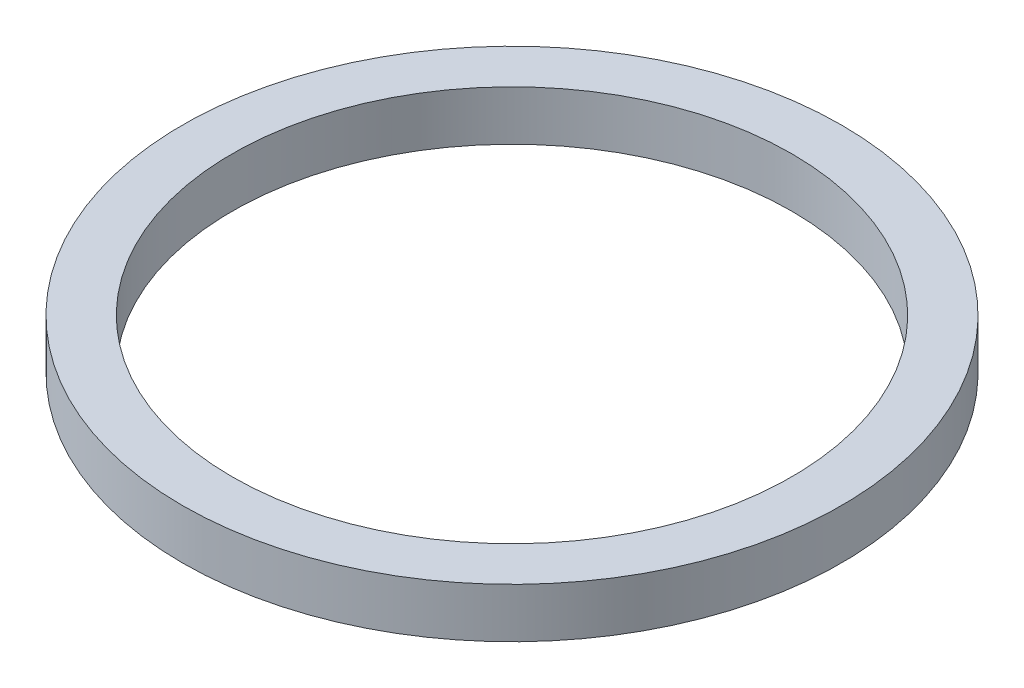
ISO-10303-21;
HEADER;
FILE_DESCRIPTION(('STEP AP214'),'2;1');
FILE_NAME('part.step','',(''),(''),'','','');
FILE_SCHEMA(('AUTOMOTIVE_DESIGN { 1 0 10303 214 1 1 1 1 }'));
ENDSEC;
DATA;
#1=APPLICATION_CONTEXT('core data for automotive mechanical design processes');
#2=APPLICATION_PROTOCOL_DEFINITION('international standard','automotive_design',2000,#1);
#3=PRODUCT_CONTEXT('',#1,'mechanical');
#4=PRODUCT('Part','Part','',(#3));
#5=PRODUCT_RELATED_PRODUCT_CATEGORY('part','',(#4));
#6=PRODUCT_DEFINITION_FORMATION('','',#4);
#7=PRODUCT_DEFINITION_CONTEXT('part definition',#1,'design');
#8=PRODUCT_DEFINITION('design','',#6,#7);
#9=PRODUCT_DEFINITION_SHAPE('','',#8);
#10=(LENGTH_UNIT() NAMED_UNIT(*) SI_UNIT(.MILLI.,.METRE.));
#11=(NAMED_UNIT(*) PLANE_ANGLE_UNIT() SI_UNIT($,.RADIAN.));
#12=(NAMED_UNIT(*) SI_UNIT($,.STERADIAN.) SOLID_ANGLE_UNIT());
#13=UNCERTAINTY_MEASURE_WITH_UNIT(LENGTH_MEASURE(1.E-05),#10,'distance_accuracy_value','');
#14=(GEOMETRIC_REPRESENTATION_CONTEXT(3) GLOBAL_UNCERTAINTY_ASSIGNED_CONTEXT((#13)) GLOBAL_UNIT_ASSIGNED_CONTEXT((#10,
#11,#12)) REPRESENTATION_CONTEXT('',''));
#15=CARTESIAN_POINT('',(0.,0.,0.));
#16=DIRECTION('',(0.,0.,1.));
#17=DIRECTION('',(1.,0.,0.));
#18=AXIS2_PLACEMENT_3D('',#15,#16,#17);
#19=CARTESIAN_POINT('',(0.,8.,0.));
#20=DIRECTION('',(0.,1.,0.));
#21=DIRECTION('',(0.,0.,1.));
#22=AXIS2_PLACEMENT_3D('',#19,#20,#21);
#23=PLANE('',#22);
#24=CARTESIAN_POINT('',(0.,8.,0.));
#25=DIRECTION('',(0.,1.,0.));
#26=DIRECTION('',(0.,0.,1.));
#27=AXIS2_PLACEMENT_3D('',#24,#25,#26);
#28=CIRCLE('',#27,53.);
#29=CARTESIAN_POINT('',(0.,8.,53.));
#30=VERTEX_POINT('',#29);
#31=EDGE_CURVE('E10',#30,#30,#28,.T.);
#32=ORIENTED_EDGE('',*,*,#31,.T.);
#33=EDGE_LOOP('',(#32));
#34=FACE_BOUND('',#33,.T.);
#35=CARTESIAN_POINT('',(0.,8.,0.));
#36=DIRECTION('',(0.,1.,0.));
#37=DIRECTION('',(0.,0.,1.));
#38=AXIS2_PLACEMENT_3D('',#35,#36,#37);
#39=CIRCLE('',#38,45.);
#40=CARTESIAN_POINT('',(0.,8.,45.));
#41=VERTEX_POINT('',#40);
#42=EDGE_CURVE('E43',#41,#41,#39,.T.);
#43=ORIENTED_EDGE('',*,*,#42,.F.);
#44=EDGE_LOOP('',(#43));
#45=FACE_BOUND('',#44,.T.);
#46=ADVANCED_FACE('F32',(#34,#45),#23,.T.);
#47=CARTESIAN_POINT('',(0.,0.,0.));
#48=DIRECTION('',(0.,1.,0.));
#49=DIRECTION('',(0.,0.,1.));
#50=AXIS2_PLACEMENT_3D('',#47,#48,#49);
#51=PLANE('',#50);
#52=CARTESIAN_POINT('',(0.,0.,0.));
#53=DIRECTION('',(0.,1.,0.));
#54=DIRECTION('',(0.,0.,1.));
#55=AXIS2_PLACEMENT_3D('',#52,#53,#54);
#56=CIRCLE('',#55,53.);
#57=CARTESIAN_POINT('',(0.,0.,53.));
#58=VERTEX_POINT('',#57);
#59=EDGE_CURVE('E36',#58,#58,#56,.T.);
#60=ORIENTED_EDGE('',*,*,#59,.F.);
#61=EDGE_LOOP('',(#60));
#62=FACE_BOUND('',#61,.T.);
#63=CARTESIAN_POINT('',(0.,0.,0.));
#64=DIRECTION('',(0.,1.,0.));
#65=DIRECTION('',(0.,0.,1.));
#66=AXIS2_PLACEMENT_3D('',#63,#64,#65);
#67=CIRCLE('',#66,45.);
#68=CARTESIAN_POINT('',(0.,0.,45.));
#69=VERTEX_POINT('',#68);
#70=EDGE_CURVE('E45',#69,#69,#67,.T.);
#71=ORIENTED_EDGE('',*,*,#70,.T.);
#72=EDGE_LOOP('',(#71));
#73=FACE_BOUND('',#72,.T.);
#74=ADVANCED_FACE('F55',(#62,#73),#51,.F.);
#75=CARTESIAN_POINT('',(0.,8.,0.));
#76=DIRECTION('',(0.,-1.,0.));
#77=DIRECTION('',(0.,0.,-1.));
#78=AXIS2_PLACEMENT_3D('',#75,#76,#77);
#79=CYLINDRICAL_SURFACE('',#78,53.);
#80=ORIENTED_EDGE('',*,*,#31,.F.);
#81=EDGE_LOOP('',(#80));
#82=FACE_BOUND('',#81,.T.);
#83=ORIENTED_EDGE('',*,*,#59,.T.);
#84=EDGE_LOOP('',(#83));
#85=FACE_BOUND('',#84,.T.);
#86=ADVANCED_FACE('F34',(#82,#85),#79,.T.);
#87=CARTESIAN_POINT('',(0.,8.,0.));
#88=DIRECTION('',(0.,-1.,0.));
#89=DIRECTION('',(0.,0.,-1.));
#90=AXIS2_PLACEMENT_3D('',#87,#88,#89);
#91=CYLINDRICAL_SURFACE('',#90,45.);
#92=ORIENTED_EDGE('',*,*,#42,.T.);
#93=EDGE_LOOP('',(#92));
#94=FACE_BOUND('',#93,.T.);
#95=ORIENTED_EDGE('',*,*,#70,.F.);
#96=EDGE_LOOP('',(#95));
#97=FACE_BOUND('',#96,.T.);
#98=ADVANCED_FACE('F51',(#94,#97),#91,.F.);
#99=CLOSED_SHELL('',(#46,#74,#86,#98));
#100=MANIFOLD_SOLID_BREP('B2',#99);
#101=ADVANCED_BREP_SHAPE_REPRESENTATION('',(#18,#100),#14);
#102=SHAPE_DEFINITION_REPRESENTATION(#9,#101);
ENDSEC;
END-ISO-10303-21;
